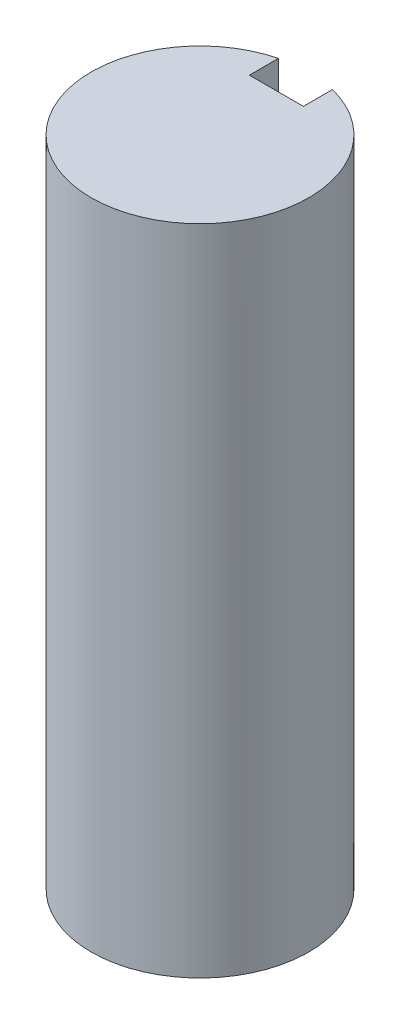
ISO-10303-21;
HEADER;
FILE_DESCRIPTION(('STEP AP214'),'2;1');
FILE_NAME('part.step','',(''),(''),'','','');
FILE_SCHEMA(('AUTOMOTIVE_DESIGN { 1 0 10303 214 1 1 1 1 }'));
ENDSEC;
DATA;
#1=APPLICATION_CONTEXT('core data for automotive mechanical design processes');
#2=APPLICATION_PROTOCOL_DEFINITION('international standard','automotive_design',2000,#1);
#3=PRODUCT_CONTEXT('',#1,'mechanical');
#4=PRODUCT('Part','Part','',(#3));
#5=PRODUCT_RELATED_PRODUCT_CATEGORY('part','',(#4));
#6=PRODUCT_DEFINITION_FORMATION('','',#4);
#7=PRODUCT_DEFINITION_CONTEXT('part definition',#1,'design');
#8=PRODUCT_DEFINITION('design','',#6,#7);
#9=PRODUCT_DEFINITION_SHAPE('','',#8);
#10=(LENGTH_UNIT() NAMED_UNIT(*) SI_UNIT(.MILLI.,.METRE.));
#11=(NAMED_UNIT(*) PLANE_ANGLE_UNIT() SI_UNIT($,.RADIAN.));
#12=(NAMED_UNIT(*) SI_UNIT($,.STERADIAN.) SOLID_ANGLE_UNIT());
#13=UNCERTAINTY_MEASURE_WITH_UNIT(LENGTH_MEASURE(1.E-05),#10,'distance_accuracy_value','');
#14=(GEOMETRIC_REPRESENTATION_CONTEXT(3) GLOBAL_UNCERTAINTY_ASSIGNED_CONTEXT((#13)) GLOBAL_UNIT_ASSIGNED_CONTEXT((#10,
#11,#12)) REPRESENTATION_CONTEXT('',''));
#15=CARTESIAN_POINT('',(0.,0.,0.));
#16=DIRECTION('',(0.,0.,1.));
#17=DIRECTION('',(1.,0.,0.));
#18=AXIS2_PLACEMENT_3D('',#15,#16,#17);
#19=CARTESIAN_POINT('',(705.049944912356,259.580554411073,-4.45371459078865));
#20=DIRECTION('',(0.,0.,-1.));
#21=DIRECTION('',(-1.,0.,0.));
#22=AXIS2_PLACEMENT_3D('',#19,#20,#21);
#23=PLANE('',#22);
#24=DIRECTION('',(0.,1.,0.));
#25=VECTOR('',#24,1.);
#26=CARTESIAN_POINT('',(708.198663230184,259.580554411073,-4.45371459078865));
#27=LINE('',#26,#25);
#28=CARTESIAN_POINT('',(708.198663230184,289.552554411073,-4.45371459078865));
#29=VERTEX_POINT('',#28);
#30=CARTESIAN_POINT('',(708.198663230184,297.680554411073,-4.45371459078865));
#31=VERTEX_POINT('',#30);
#32=EDGE_CURVE('E36',#29,#31,#27,.T.);
#33=ORIENTED_EDGE('',*,*,#32,.F.);
#34=DIRECTION('',(-1.,0.,0.));
#35=VECTOR('',#34,1.);
#36=CARTESIAN_POINT('',(705.049944912356,289.552554411073,-4.45371459078865));
#37=LINE('',#36,#35);
#38=CARTESIAN_POINT('',(705.049944912356,289.552554411073,-4.45371459078865));
#39=VERTEX_POINT('',#38);
#40=EDGE_CURVE('E50',#29,#39,#37,.T.);
#41=ORIENTED_EDGE('',*,*,#40,.T.);
#42=DIRECTION('',(0.,1.,0.));
#43=VECTOR('',#42,1.);
#44=CARTESIAN_POINT('',(705.049944912356,259.580554411073,-4.45371459078865));
#45=LINE('',#44,#43);
#46=CARTESIAN_POINT('',(705.049944912355,297.680554411073,-4.45371459078865));
#47=VERTEX_POINT('',#46);
#48=EDGE_CURVE('E86',#47,#39,#45,.F.);
#49=ORIENTED_EDGE('',*,*,#48,.F.);
#50=DIRECTION('',(1.,0.,0.));
#51=VECTOR('',#50,1.);
#52=CARTESIAN_POINT('',(706.62430407127,297.680554411073,-4.45371459078865));
#53=LINE('',#52,#51);
#54=EDGE_CURVE('E76',#31,#47,#53,.F.);
#55=ORIENTED_EDGE('',*,*,#54,.F.);
#56=EDGE_LOOP('',(#33,#41,#49,#55));
#57=FACE_BOUND('',#56,.T.);
#58=ADVANCED_FACE('F33',(#57),#23,.T.);
#59=CARTESIAN_POINT('',(705.049944912355,259.580554411073,-6.15173904182711));
#60=DIRECTION('',(1.,0.,-1.06286958808332E-13));
#61=DIRECTION('',(-1.06286958808332E-13,0.,-1.));
#62=AXIS2_PLACEMENT_3D('',#59,#60,#61);
#63=PLANE('',#62);
#64=ORIENTED_EDGE('',*,*,#48,.T.);
#65=DIRECTION('',(-1.06286958808332E-13,0.,-1.));
#66=VECTOR('',#65,1.);
#67=CARTESIAN_POINT('',(705.049944912355,289.552554411073,-6.15173904182711));
#68=LINE('',#67,#66);
#69=CARTESIAN_POINT('',(705.049944912355,289.552554411073,-6.15173904182709));
#70=VERTEX_POINT('',#69);
#71=EDGE_CURVE('E84',#39,#70,#68,.T.);
#72=ORIENTED_EDGE('',*,*,#71,.T.);
#73=DIRECTION('',(0.,1.,0.));
#74=VECTOR('',#73,1.);
#75=CARTESIAN_POINT('',(705.049944912355,259.580554411073,-6.15173904182709));
#76=LINE('',#75,#74);
#77=CARTESIAN_POINT('',(705.049944912355,297.680554411073,-6.15173904182709));
#78=VERTEX_POINT('',#77);
#79=EDGE_CURVE('E92',#78,#70,#76,.F.);
#80=ORIENTED_EDGE('',*,*,#79,.F.);
#81=DIRECTION('',(-1.06286958808332E-13,0.,-1.));
#82=VECTOR('',#81,1.);
#83=CARTESIAN_POINT('',(705.049944912355,297.680554411073,-6.15173904182711));
#84=LINE('',#83,#82);
#85=EDGE_CURVE('E80',#78,#47,#84,.F.);
#86=ORIENTED_EDGE('',*,*,#85,.T.);
#87=EDGE_LOOP('',(#64,#72,#80,#86));
#88=FACE_BOUND('',#87,.T.);
#89=ADVANCED_FACE('F90',(#88),#63,.T.);
#90=CARTESIAN_POINT('',(708.198663230184,259.580554411073,-4.45371459078865));
#91=DIRECTION('',(-1.,0.,0.));
#92=DIRECTION('',(0.,0.,1.));
#93=AXIS2_PLACEMENT_3D('',#90,#91,#92);
#94=PLANE('',#93);
#95=DIRECTION('',(0.,1.,0.));
#96=VECTOR('',#95,1.);
#97=CARTESIAN_POINT('',(708.198663230184,259.580554411073,-6.15173904182709));
#98=LINE('',#97,#96);
#99=CARTESIAN_POINT('',(708.198663230184,289.552554411073,-6.15173904182709));
#100=VERTEX_POINT('',#99);
#101=CARTESIAN_POINT('',(708.198663230184,297.680554411073,-6.15173904182709));
#102=VERTEX_POINT('',#101);
#103=EDGE_CURVE('E11',#100,#102,#98,.T.);
#104=ORIENTED_EDGE('',*,*,#103,.F.);
#105=DIRECTION('',(0.,0.,1.));
#106=VECTOR('',#105,1.);
#107=CARTESIAN_POINT('',(708.198663230184,289.552554411073,-4.45371459078865));
#108=LINE('',#107,#106);
#109=EDGE_CURVE('E58',#100,#29,#108,.T.);
#110=ORIENTED_EDGE('',*,*,#109,.T.);
#111=ORIENTED_EDGE('',*,*,#32,.T.);
#112=DIRECTION('',(0.,0.,1.));
#113=VECTOR('',#112,1.);
#114=CARTESIAN_POINT('',(708.198663230184,297.680554411073,-4.45371459078865));
#115=LINE('',#114,#113);
#116=EDGE_CURVE('E83',#31,#102,#115,.F.);
#117=ORIENTED_EDGE('',*,*,#116,.T.);
#118=EDGE_LOOP('',(#104,#110,#111,#117));
#119=FACE_BOUND('',#118,.T.);
#120=ADVANCED_FACE('F110',(#119),#94,.T.);
#121=CARTESIAN_POINT('',(706.62430407127,297.680554411073,-0.806682032206577));
#122=DIRECTION('',(0.,1.,0.));
#123=DIRECTION('',(0.,0.,1.));
#124=AXIS2_PLACEMENT_3D('',#121,#122,#123);
#125=PLANE('',#124);
#126=CARTESIAN_POINT('',(706.62430407127,297.680554411073,2.56616949911859E-13));
#127=DIRECTION('',(0.,1.,0.));
#128=DIRECTION('',(0.,0.,1.));
#129=AXIS2_PLACEMENT_3D('',#126,#127,#128);
#130=CIRCLE('',#129,6.35);
#131=EDGE_CURVE('E108',#102,#78,#130,.F.);
#132=ORIENTED_EDGE('',*,*,#131,.F.);
#133=ORIENTED_EDGE('',*,*,#116,.F.);
#134=ORIENTED_EDGE('',*,*,#54,.T.);
#135=ORIENTED_EDGE('',*,*,#85,.F.);
#136=EDGE_LOOP('',(#132,#133,#134,#135));
#137=FACE_BOUND('',#136,.T.);
#138=ADVANCED_FACE('F78',(#137),#125,.T.);
#139=CARTESIAN_POINT('',(706.62430407127,259.580554411073,-0.806682032206577));
#140=DIRECTION('',(0.,1.,0.));
#141=DIRECTION('',(0.,0.,1.));
#142=AXIS2_PLACEMENT_3D('',#139,#140,#141);
#143=PLANE('',#142);
#144=CARTESIAN_POINT('',(706.62430407127,259.580554411073,2.56616949911859E-13));
#145=DIRECTION('',(0.,1.,0.));
#146=DIRECTION('',(0.,0.,1.));
#147=AXIS2_PLACEMENT_3D('',#144,#145,#146);
#148=CIRCLE('',#147,6.35);
#149=CARTESIAN_POINT('',(706.62430407127,259.580554411073,6.35000000000026));
#150=VERTEX_POINT('',#149);
#151=EDGE_CURVE('E42',#150,#150,#148,.T.);
#152=ORIENTED_EDGE('',*,*,#151,.F.);
#153=EDGE_LOOP('',(#152));
#154=FACE_BOUND('',#153,.T.);
#155=ADVANCED_FACE('F122',(#154),#143,.F.);
#156=CARTESIAN_POINT('',(706.62430407127,259.580554411073,2.56616949911859E-13));
#157=DIRECTION('',(0.,1.,0.));
#158=DIRECTION('',(0.,0.,1.));
#159=AXIS2_PLACEMENT_3D('',#156,#157,#158);
#160=CYLINDRICAL_SURFACE('',#159,6.35);
#161=ORIENTED_EDGE('',*,*,#151,.T.);
#162=EDGE_LOOP('',(#161));
#163=FACE_BOUND('',#162,.T.);
#164=ORIENTED_EDGE('',*,*,#79,.T.);
#165=CARTESIAN_POINT('',(706.62430407127,289.552554411073,2.56616949911859E-13));
#166=DIRECTION('',(0.,-1.,0.));
#167=DIRECTION('',(0.,0.,-1.));
#168=AXIS2_PLACEMENT_3D('',#165,#166,#167);
#169=CIRCLE('',#168,6.35000000000005);
#170=EDGE_CURVE('E117',#70,#100,#169,.T.);
#171=ORIENTED_EDGE('',*,*,#170,.T.);
#172=ORIENTED_EDGE('',*,*,#103,.T.);
#173=ORIENTED_EDGE('',*,*,#131,.T.);
#174=EDGE_LOOP('',(#164,#171,#172,#173));
#175=FACE_BOUND('',#174,.T.);
#176=ADVANCED_FACE('F120',(#163,#175),#160,.T.);
#177=CARTESIAN_POINT('',(706.62430407127,289.552554411073,2.56616949911859E-13));
#178=DIRECTION('',(0.,-1.,0.));
#179=DIRECTION('',(0.,0.,-1.));
#180=AXIS2_PLACEMENT_3D('',#177,#178,#179);
#181=PLANE('',#180);
#182=ORIENTED_EDGE('',*,*,#71,.F.);
#183=ORIENTED_EDGE('',*,*,#40,.F.);
#184=ORIENTED_EDGE('',*,*,#109,.F.);
#185=ORIENTED_EDGE('',*,*,#170,.F.);
#186=EDGE_LOOP('',(#182,#183,#184,#185));
#187=FACE_BOUND('',#186,.T.);
#188=ADVANCED_FACE('F112',(#187),#181,.F.);
#189=CLOSED_SHELL('',(#58,#89,#120,#138,#155,#176,#188));
#190=MANIFOLD_SOLID_BREP('B2',#189);
#191=ADVANCED_BREP_SHAPE_REPRESENTATION('',(#18,#190),#14);
#192=SHAPE_DEFINITION_REPRESENTATION(#9,#191);
ENDSEC;
END-ISO-10303-21;
